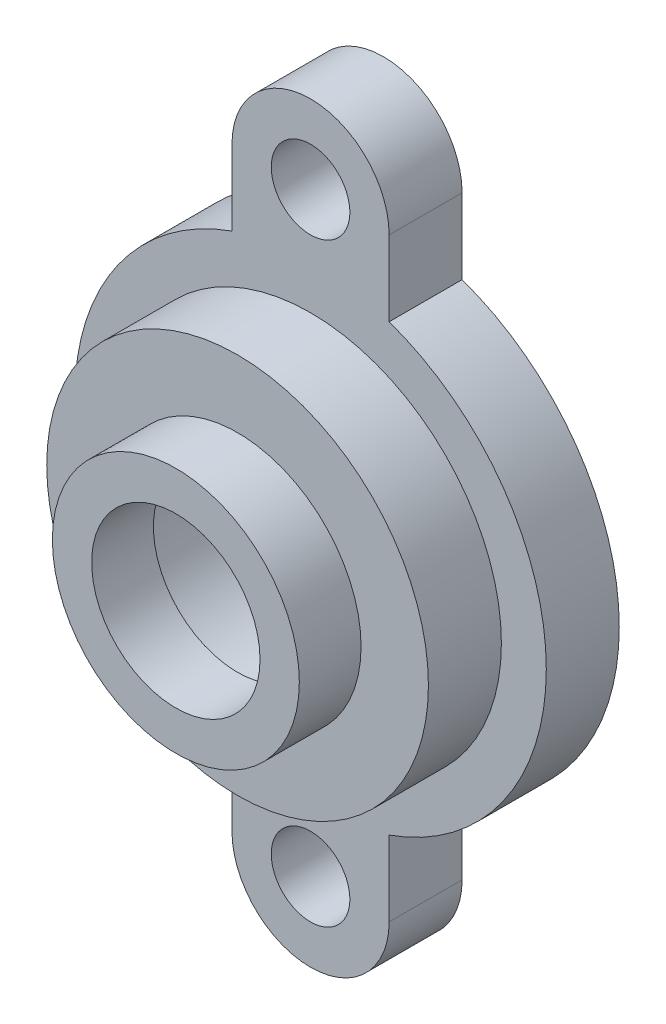
ISO-10303-21;
HEADER;
FILE_DESCRIPTION(('STEP AP214'),'2;1');
FILE_NAME('part.step','',(''),(''),'','','');
FILE_SCHEMA(('AUTOMOTIVE_DESIGN { 1 0 10303 214 1 1 1 1 }'));
ENDSEC;
DATA;
#1=APPLICATION_CONTEXT('core data for automotive mechanical design processes');
#2=APPLICATION_PROTOCOL_DEFINITION('international standard','automotive_design',2000,#1);
#3=PRODUCT_CONTEXT('',#1,'mechanical');
#4=PRODUCT('Part','Part','',(#3));
#5=PRODUCT_RELATED_PRODUCT_CATEGORY('part','',(#4));
#6=PRODUCT_DEFINITION_FORMATION('','',#4);
#7=PRODUCT_DEFINITION_CONTEXT('part definition',#1,'design');
#8=PRODUCT_DEFINITION('design','',#6,#7);
#9=PRODUCT_DEFINITION_SHAPE('','',#8);
#10=(LENGTH_UNIT() NAMED_UNIT(*) SI_UNIT(.MILLI.,.METRE.));
#11=(NAMED_UNIT(*) PLANE_ANGLE_UNIT() SI_UNIT($,.RADIAN.));
#12=(NAMED_UNIT(*) SI_UNIT($,.STERADIAN.) SOLID_ANGLE_UNIT());
#13=UNCERTAINTY_MEASURE_WITH_UNIT(LENGTH_MEASURE(1.E-05),#10,'distance_accuracy_value','');
#14=(GEOMETRIC_REPRESENTATION_CONTEXT(3) GLOBAL_UNCERTAINTY_ASSIGNED_CONTEXT((#13)) GLOBAL_UNIT_ASSIGNED_CONTEXT((#10,
#11,#12)) REPRESENTATION_CONTEXT('',''));
#15=CARTESIAN_POINT('',(0.,0.,0.));
#16=DIRECTION('',(0.,0.,1.));
#17=DIRECTION('',(1.,0.,0.));
#18=AXIS2_PLACEMENT_3D('',#15,#16,#17);
#19=CARTESIAN_POINT('',(0.,0.,6.5));
#20=DIRECTION('',(0.,0.,-1.));
#21=DIRECTION('',(-1.,0.,0.));
#22=AXIS2_PLACEMENT_3D('',#19,#20,#21);
#23=CYLINDRICAL_SURFACE('',#22,21.);
#24=DIRECTION('',(0.,0.,-1.));
#25=VECTOR('',#24,1.);
#26=CARTESIAN_POINT('',(7.,19.7989898732233,6.5));
#27=LINE('',#26,#25);
#28=CARTESIAN_POINT('',(7.,19.7989898732233,6.5));
#29=VERTEX_POINT('',#28);
#30=CARTESIAN_POINT('',(7.,19.7989898732233,0.));
#31=VERTEX_POINT('',#30);
#32=EDGE_CURVE('E140',#29,#31,#27,.T.);
#33=ORIENTED_EDGE('',*,*,#32,.F.);
#34=CARTESIAN_POINT('',(0.,0.,6.5));
#35=DIRECTION('',(0.,0.,1.));
#36=DIRECTION('',(1.,0.,0.));
#37=AXIS2_PLACEMENT_3D('',#34,#35,#36);
#38=CIRCLE('',#37,21.);
#39=CARTESIAN_POINT('',(7.,-19.7989898732233,6.5));
#40=VERTEX_POINT('',#39);
#41=EDGE_CURVE('E47',#40,#29,#38,.T.);
#42=ORIENTED_EDGE('',*,*,#41,.F.);
#43=DIRECTION('',(0.,0.,-1.));
#44=VECTOR('',#43,1.);
#45=CARTESIAN_POINT('',(7.,-19.7989898732233,6.5));
#46=LINE('',#45,#44);
#47=CARTESIAN_POINT('',(7.,-19.7989898732233,0.));
#48=VERTEX_POINT('',#47);
#49=EDGE_CURVE('E110',#48,#40,#46,.F.);
#50=ORIENTED_EDGE('',*,*,#49,.F.);
#51=CARTESIAN_POINT('',(0.,0.,0.));
#52=DIRECTION('',(0.,0.,1.));
#53=DIRECTION('',(1.,0.,0.));
#54=AXIS2_PLACEMENT_3D('',#51,#52,#53);
#55=CIRCLE('',#54,21.);
#56=EDGE_CURVE('E42',#48,#31,#55,.T.);
#57=ORIENTED_EDGE('',*,*,#56,.T.);
#58=EDGE_LOOP('',(#33,#42,#50,#57));
#59=FACE_BOUND('',#58,.T.);
#60=ADVANCED_FACE('F39',(#59),#23,.T.);
#61=DIRECTION('',(0.,0.,-1.));
#62=VECTOR('',#61,1.);
#63=CARTESIAN_POINT('',(-7.,-19.7989898732233,6.5));
#64=LINE('',#63,#62);
#65=CARTESIAN_POINT('',(-7.,-19.7989898732233,6.5));
#66=VERTEX_POINT('',#65);
#67=CARTESIAN_POINT('',(-7.,-19.7989898732233,0.));
#68=VERTEX_POINT('',#67);
#69=EDGE_CURVE('E61',#66,#68,#64,.T.);
#70=ORIENTED_EDGE('',*,*,#69,.F.);
#71=CARTESIAN_POINT('',(-7.,19.7989898732233,6.5));
#72=VERTEX_POINT('',#71);
#73=EDGE_CURVE('E11',#72,#66,#38,.T.);
#74=ORIENTED_EDGE('',*,*,#73,.F.);
#75=DIRECTION('',(0.,0.,-1.));
#76=VECTOR('',#75,1.);
#77=CARTESIAN_POINT('',(-7.,19.7989898732233,6.5));
#78=LINE('',#77,#76);
#79=CARTESIAN_POINT('',(-7.,19.7989898732233,0.));
#80=VERTEX_POINT('',#79);
#81=EDGE_CURVE('E128',#80,#72,#78,.F.);
#82=ORIENTED_EDGE('',*,*,#81,.F.);
#83=EDGE_CURVE('E142',#80,#68,#55,.T.);
#84=ORIENTED_EDGE('',*,*,#83,.T.);
#85=EDGE_LOOP('',(#70,#74,#82,#84));
#86=FACE_BOUND('',#85,.T.);
#87=ADVANCED_FACE('F177',(#86),#23,.T.);
#88=CARTESIAN_POINT('',(0.,0.,6.5));
#89=DIRECTION('',(0.,0.,1.));
#90=DIRECTION('',(1.,0.,0.));
#91=AXIS2_PLACEMENT_3D('',#88,#89,#90);
#92=PLANE('',#91);
#93=CARTESIAN_POINT('',(0.,0.,6.5));
#94=DIRECTION('',(0.,0.,1.));
#95=DIRECTION('',(1.,0.,0.));
#96=AXIS2_PLACEMENT_3D('',#93,#94,#95);
#97=CIRCLE('',#96,17.);
#98=CARTESIAN_POINT('',(17.,0.,6.5));
#99=VERTEX_POINT('',#98);
#100=EDGE_CURVE('E187',#99,#99,#97,.F.);
#101=ORIENTED_EDGE('',*,*,#100,.T.);
#102=EDGE_LOOP('',(#101));
#103=FACE_BOUND('',#102,.T.);
#104=CARTESIAN_POINT('',(0.,26.5,6.5));
#105=DIRECTION('',(0.,0.,1.));
#106=DIRECTION('',(1.,0.,0.));
#107=AXIS2_PLACEMENT_3D('',#104,#105,#106);
#108=CIRCLE('',#107,3.5);
#109=CARTESIAN_POINT('',(-3.5,26.5,6.5));
#110=VERTEX_POINT('',#109);
#111=EDGE_CURVE('E183',#110,#110,#108,.T.);
#112=ORIENTED_EDGE('',*,*,#111,.F.);
#113=EDGE_LOOP('',(#112));
#114=FACE_BOUND('',#113,.T.);
#115=CARTESIAN_POINT('',(0.,-26.5,6.5));
#116=DIRECTION('',(0.,0.,1.));
#117=DIRECTION('',(1.,0.,0.));
#118=AXIS2_PLACEMENT_3D('',#115,#116,#117);
#119=CIRCLE('',#118,3.5);
#120=CARTESIAN_POINT('',(-3.5,-26.5,6.5));
#121=VERTEX_POINT('',#120);
#122=EDGE_CURVE('E190',#121,#121,#119,.T.);
#123=ORIENTED_EDGE('',*,*,#122,.F.);
#124=EDGE_LOOP('',(#123));
#125=FACE_BOUND('',#124,.T.);
#126=ORIENTED_EDGE('',*,*,#73,.T.);
#127=DIRECTION('',(0.,-1.,0.));
#128=VECTOR('',#127,1.);
#129=CARTESIAN_POINT('',(-7.,-26.5,6.5));
#130=LINE('',#129,#128);
#131=CARTESIAN_POINT('',(-7.,-26.5,6.5));
#132=VERTEX_POINT('',#131);
#133=EDGE_CURVE('E119',#66,#132,#130,.T.);
#134=ORIENTED_EDGE('',*,*,#133,.T.);
#135=CARTESIAN_POINT('',(0.,-26.5,6.5));
#136=DIRECTION('',(0.,0.,1.));
#137=DIRECTION('',(1.,0.,0.));
#138=AXIS2_PLACEMENT_3D('',#135,#136,#137);
#139=CIRCLE('',#138,7.);
#140=CARTESIAN_POINT('',(7.,-26.5,6.5));
#141=VERTEX_POINT('',#140);
#142=EDGE_CURVE('E116',#132,#141,#139,.T.);
#143=ORIENTED_EDGE('',*,*,#142,.T.);
#144=DIRECTION('',(0.,1.,0.));
#145=VECTOR('',#144,1.);
#146=CARTESIAN_POINT('',(7.,-26.5,6.5));
#147=LINE('',#146,#145);
#148=EDGE_CURVE('E103',#141,#40,#147,.T.);
#149=ORIENTED_EDGE('',*,*,#148,.T.);
#150=ORIENTED_EDGE('',*,*,#41,.T.);
#151=CARTESIAN_POINT('',(7.,26.5,6.5));
#152=VERTEX_POINT('',#151);
#153=EDGE_CURVE('E113',#29,#152,#147,.T.);
#154=ORIENTED_EDGE('',*,*,#153,.T.);
#155=CARTESIAN_POINT('',(0.,26.5,6.5));
#156=DIRECTION('',(0.,0.,1.));
#157=DIRECTION('',(1.,0.,0.));
#158=AXIS2_PLACEMENT_3D('',#155,#156,#157);
#159=CIRCLE('',#158,7.);
#160=CARTESIAN_POINT('',(-7.,26.5,6.5));
#161=VERTEX_POINT('',#160);
#162=EDGE_CURVE('E112',#152,#161,#159,.T.);
#163=ORIENTED_EDGE('',*,*,#162,.T.);
#164=EDGE_CURVE('E167',#161,#72,#130,.T.);
#165=ORIENTED_EDGE('',*,*,#164,.T.);
#166=EDGE_LOOP('',(#126,#134,#143,#149,#150,#154,#163,#165));
#167=FACE_BOUND('',#166,.T.);
#168=ADVANCED_FACE('F117',(#103,#114,#125,#167),#92,.T.);
#169=CARTESIAN_POINT('',(0.,0.,0.));
#170=DIRECTION('',(0.,0.,1.));
#171=DIRECTION('',(1.,0.,0.));
#172=AXIS2_PLACEMENT_3D('',#169,#170,#171);
#173=PLANE('',#172);
#174=CARTESIAN_POINT('',(0.,26.5,0.));
#175=DIRECTION('',(0.,0.,1.));
#176=DIRECTION('',(1.,0.,0.));
#177=AXIS2_PLACEMENT_3D('',#174,#175,#176);
#178=CIRCLE('',#177,3.5);
#179=CARTESIAN_POINT('',(-3.5,26.5,0.));
#180=VERTEX_POINT('',#179);
#181=EDGE_CURVE('E186',#180,#180,#178,.T.);
#182=ORIENTED_EDGE('',*,*,#181,.T.);
#183=EDGE_LOOP('',(#182));
#184=FACE_BOUND('',#183,.T.);
#185=CARTESIAN_POINT('',(0.,-26.5,0.));
#186=DIRECTION('',(0.,0.,1.));
#187=DIRECTION('',(1.,0.,0.));
#188=AXIS2_PLACEMENT_3D('',#185,#186,#187);
#189=CIRCLE('',#188,3.5);
#190=CARTESIAN_POINT('',(-3.5,-26.5,0.));
#191=VERTEX_POINT('',#190);
#192=EDGE_CURVE('E182',#191,#191,#189,.T.);
#193=ORIENTED_EDGE('',*,*,#192,.T.);
#194=EDGE_LOOP('',(#193));
#195=FACE_BOUND('',#194,.T.);
#196=ORIENTED_EDGE('',*,*,#83,.F.);
#197=DIRECTION('',(0.,-1.,0.));
#198=VECTOR('',#197,1.);
#199=CARTESIAN_POINT('',(-7.,-26.5,0.));
#200=LINE('',#199,#198);
#201=CARTESIAN_POINT('',(-7.,26.5,0.));
#202=VERTEX_POINT('',#201);
#203=EDGE_CURVE('E123',#202,#80,#200,.T.);
#204=ORIENTED_EDGE('',*,*,#203,.F.);
#205=CARTESIAN_POINT('',(0.,26.5,0.));
#206=DIRECTION('',(0.,0.,1.));
#207=DIRECTION('',(1.,0.,0.));
#208=AXIS2_PLACEMENT_3D('',#205,#206,#207);
#209=CIRCLE('',#208,7.);
#210=CARTESIAN_POINT('',(7.,26.5,0.));
#211=VERTEX_POINT('',#210);
#212=EDGE_CURVE('E155',#211,#202,#209,.T.);
#213=ORIENTED_EDGE('',*,*,#212,.F.);
#214=DIRECTION('',(0.,1.,0.));
#215=VECTOR('',#214,1.);
#216=CARTESIAN_POINT('',(7.,-26.5,0.));
#217=LINE('',#216,#215);
#218=EDGE_CURVE('E150',#31,#211,#217,.T.);
#219=ORIENTED_EDGE('',*,*,#218,.F.);
#220=ORIENTED_EDGE('',*,*,#56,.F.);
#221=CARTESIAN_POINT('',(7.,-26.5,0.));
#222=VERTEX_POINT('',#221);
#223=EDGE_CURVE('E156',#222,#48,#217,.T.);
#224=ORIENTED_EDGE('',*,*,#223,.F.);
#225=CARTESIAN_POINT('',(0.,-26.5,0.));
#226=DIRECTION('',(0.,0.,1.));
#227=DIRECTION('',(1.,0.,0.));
#228=AXIS2_PLACEMENT_3D('',#225,#226,#227);
#229=CIRCLE('',#228,7.);
#230=CARTESIAN_POINT('',(-7.,-26.5,0.));
#231=VERTEX_POINT('',#230);
#232=EDGE_CURVE('E127',#231,#222,#229,.T.);
#233=ORIENTED_EDGE('',*,*,#232,.F.);
#234=EDGE_CURVE('E163',#68,#231,#200,.T.);
#235=ORIENTED_EDGE('',*,*,#234,.F.);
#236=EDGE_LOOP('',(#196,#204,#213,#219,#220,#224,#233,#235));
#237=FACE_BOUND('',#236,.T.);
#238=CARTESIAN_POINT('',(0.,0.,0.));
#239=DIRECTION('',(0.,0.,1.));
#240=DIRECTION('',(1.,0.,0.));
#241=AXIS2_PLACEMENT_3D('',#238,#239,#240);
#242=CIRCLE('',#241,9.5);
#243=CARTESIAN_POINT('',(-9.5,0.,0.));
#244=VERTEX_POINT('',#243);
#245=EDGE_CURVE('E158',#244,#244,#242,.T.);
#246=ORIENTED_EDGE('',*,*,#245,.T.);
#247=EDGE_LOOP('',(#246));
#248=FACE_BOUND('',#247,.T.);
#249=ADVANCED_FACE('F152',(#184,#195,#237,#248),#173,.F.);
#250=CARTESIAN_POINT('',(0.,-26.5,6.5));
#251=DIRECTION('',(0.,0.,-1.));
#252=DIRECTION('',(-1.,0.,0.));
#253=AXIS2_PLACEMENT_3D('',#250,#251,#252);
#254=CYLINDRICAL_SURFACE('',#253,7.);
#255=ORIENTED_EDGE('',*,*,#232,.T.);
#256=DIRECTION('',(0.,0.,-1.));
#257=VECTOR('',#256,1.);
#258=CARTESIAN_POINT('',(7.,-26.5,6.5));
#259=LINE('',#258,#257);
#260=EDGE_CURVE('E108',#141,#222,#259,.T.);
#261=ORIENTED_EDGE('',*,*,#260,.F.);
#262=ORIENTED_EDGE('',*,*,#142,.F.);
#263=DIRECTION('',(0.,0.,-1.));
#264=VECTOR('',#263,1.);
#265=CARTESIAN_POINT('',(-7.,-26.5,6.5));
#266=LINE('',#265,#264);
#267=EDGE_CURVE('E166',#132,#231,#266,.T.);
#268=ORIENTED_EDGE('',*,*,#267,.T.);
#269=EDGE_LOOP('',(#255,#261,#262,#268));
#270=FACE_BOUND('',#269,.T.);
#271=ADVANCED_FACE('F125',(#270),#254,.T.);
#272=CARTESIAN_POINT('',(-7.,-26.5,6.5));
#273=DIRECTION('',(1.,0.,0.));
#274=DIRECTION('',(0.,0.,-1.));
#275=AXIS2_PLACEMENT_3D('',#272,#273,#274);
#276=PLANE('',#275);
#277=ORIENTED_EDGE('',*,*,#133,.F.);
#278=ORIENTED_EDGE('',*,*,#69,.T.);
#279=ORIENTED_EDGE('',*,*,#234,.T.);
#280=ORIENTED_EDGE('',*,*,#267,.F.);
#281=EDGE_LOOP('',(#277,#278,#279,#280));
#282=FACE_BOUND('',#281,.T.);
#283=ADVANCED_FACE('F278',(#282),#276,.F.);
#284=CARTESIAN_POINT('',(7.,-26.5,6.5));
#285=DIRECTION('',(-1.,0.,0.));
#286=DIRECTION('',(0.,0.,1.));
#287=AXIS2_PLACEMENT_3D('',#284,#285,#286);
#288=PLANE('',#287);
#289=ORIENTED_EDGE('',*,*,#223,.T.);
#290=ORIENTED_EDGE('',*,*,#49,.T.);
#291=ORIENTED_EDGE('',*,*,#148,.F.);
#292=ORIENTED_EDGE('',*,*,#260,.T.);
#293=EDGE_LOOP('',(#289,#290,#291,#292));
#294=FACE_BOUND('',#293,.T.);
#295=ADVANCED_FACE('F106',(#294),#288,.F.);
#296=ORIENTED_EDGE('',*,*,#153,.F.);
#297=ORIENTED_EDGE('',*,*,#32,.T.);
#298=ORIENTED_EDGE('',*,*,#218,.T.);
#299=DIRECTION('',(0.,0.,-1.));
#300=VECTOR('',#299,1.);
#301=CARTESIAN_POINT('',(7.,26.5,6.5));
#302=LINE('',#301,#300);
#303=EDGE_CURVE('E129',#152,#211,#302,.T.);
#304=ORIENTED_EDGE('',*,*,#303,.F.);
#305=EDGE_LOOP('',(#296,#297,#298,#304));
#306=FACE_BOUND('',#305,.T.);
#307=ADVANCED_FACE('F148',(#306),#288,.F.);
#308=ORIENTED_EDGE('',*,*,#203,.T.);
#309=ORIENTED_EDGE('',*,*,#81,.T.);
#310=ORIENTED_EDGE('',*,*,#164,.F.);
#311=DIRECTION('',(0.,0.,-1.));
#312=VECTOR('',#311,1.);
#313=CARTESIAN_POINT('',(-7.,26.5,6.5));
#314=LINE('',#313,#312);
#315=EDGE_CURVE('E134',#161,#202,#314,.T.);
#316=ORIENTED_EDGE('',*,*,#315,.T.);
#317=EDGE_LOOP('',(#308,#309,#310,#316));
#318=FACE_BOUND('',#317,.T.);
#319=ADVANCED_FACE('F172',(#318),#276,.F.);
#320=CARTESIAN_POINT('',(0.,26.5,6.5));
#321=DIRECTION('',(0.,0.,-1.));
#322=DIRECTION('',(-1.,0.,0.));
#323=AXIS2_PLACEMENT_3D('',#320,#321,#322);
#324=CYLINDRICAL_SURFACE('',#323,7.);
#325=ORIENTED_EDGE('',*,*,#212,.T.);
#326=ORIENTED_EDGE('',*,*,#315,.F.);
#327=ORIENTED_EDGE('',*,*,#162,.F.);
#328=ORIENTED_EDGE('',*,*,#303,.T.);
#329=EDGE_LOOP('',(#325,#326,#327,#328));
#330=FACE_BOUND('',#329,.T.);
#331=ADVANCED_FACE('F281',(#330),#324,.T.);
#332=CARTESIAN_POINT('',(0.,0.,6.5));
#333=DIRECTION('',(0.,0.,-1.));
#334=DIRECTION('',(-1.,0.,0.));
#335=AXIS2_PLACEMENT_3D('',#332,#333,#334);
#336=CYLINDRICAL_SURFACE('',#335,9.5);
#337=CARTESIAN_POINT('',(0.,0.,13.));
#338=DIRECTION('',(0.,0.,1.));
#339=DIRECTION('',(1.,0.,0.));
#340=AXIS2_PLACEMENT_3D('',#337,#338,#339);
#341=CIRCLE('',#340,9.5);
#342=CARTESIAN_POINT('',(-9.5,0.,13.));
#343=VERTEX_POINT('',#342);
#344=EDGE_CURVE('E212',#343,#343,#341,.T.);
#345=CARTESIAN_POINT('',(-9.5,0.,0.));
#346=CARTESIAN_POINT('',(-9.5,0.,0.135416666666667));
#347=CARTESIAN_POINT('',(-9.5,0.,0.270833333333334));
#348=CARTESIAN_POINT('',(-9.5,0.,0.541666666666667));
#349=CARTESIAN_POINT('',(-9.5,0.,0.677083333333333));
#350=CARTESIAN_POINT('',(-9.5,0.,0.947916666666667));
#351=CARTESIAN_POINT('',(-9.5,0.,1.08333333333333));
#352=CARTESIAN_POINT('',(-9.5,0.,1.35416666666667));
#353=CARTESIAN_POINT('',(-9.5,0.,1.48958333333333));
#354=CARTESIAN_POINT('',(-9.5,0.,1.76041666666667));
#355=CARTESIAN_POINT('',(-9.5,0.,1.89583333333333));
#356=CARTESIAN_POINT('',(-9.5,0.,2.16666666666667));
#357=CARTESIAN_POINT('',(-9.5,0.,2.30208333333333));
#358=CARTESIAN_POINT('',(-9.5,0.,2.57291666666667));
#359=CARTESIAN_POINT('',(-9.5,0.,2.70833333333333));
#360=CARTESIAN_POINT('',(-9.5,0.,2.97916666666667));
#361=CARTESIAN_POINT('',(-9.5,0.,3.11458333333333));
#362=CARTESIAN_POINT('',(-9.5,0.,3.38541666666667));
#363=CARTESIAN_POINT('',(-9.5,0.,3.52083333333333));
#364=CARTESIAN_POINT('',(-9.5,0.,3.79166666666667));
#365=CARTESIAN_POINT('',(-9.5,0.,3.92708333333333));
#366=CARTESIAN_POINT('',(-9.5,0.,4.19791666666667));
#367=CARTESIAN_POINT('',(-9.5,0.,4.33333333333333));
#368=CARTESIAN_POINT('',(-9.5,0.,4.60416666666667));
#369=CARTESIAN_POINT('',(-9.5,0.,4.73958333333333));
#370=CARTESIAN_POINT('',(-9.5,0.,5.01041666666667));
#371=CARTESIAN_POINT('',(-9.5,0.,5.14583333333333));
#372=CARTESIAN_POINT('',(-9.5,0.,5.41666666666667));
#373=CARTESIAN_POINT('',(-9.5,0.,5.55208333333333));
#374=CARTESIAN_POINT('',(-9.5,0.,5.82291666666667));
#375=CARTESIAN_POINT('',(-9.5,0.,5.95833333333333));
#376=CARTESIAN_POINT('',(-9.5,0.,6.22916666666667));
#377=CARTESIAN_POINT('',(-9.5,0.,6.36458333333333));
#378=CARTESIAN_POINT('',(-9.5,0.,6.63541666666667));
#379=CARTESIAN_POINT('',(-9.5,0.,6.77083333333333));
#380=CARTESIAN_POINT('',(-9.5,0.,7.04166666666667));
#381=CARTESIAN_POINT('',(-9.5,0.,7.17708333333333));
#382=CARTESIAN_POINT('',(-9.5,0.,7.44791666666667));
#383=CARTESIAN_POINT('',(-9.5,0.,7.58333333333333));
#384=CARTESIAN_POINT('',(-9.5,0.,7.85416666666667));
#385=CARTESIAN_POINT('',(-9.5,0.,7.98958333333333));
#386=CARTESIAN_POINT('',(-9.5,0.,8.26041666666667));
#387=CARTESIAN_POINT('',(-9.5,0.,8.39583333333333));
#388=CARTESIAN_POINT('',(-9.5,0.,8.66666666666667));
#389=CARTESIAN_POINT('',(-9.5,0.,8.80208333333333));
#390=CARTESIAN_POINT('',(-9.5,0.,9.07291666666667));
#391=CARTESIAN_POINT('',(-9.5,0.,9.20833333333333));
#392=CARTESIAN_POINT('',(-9.5,0.,9.47916666666667));
#393=CARTESIAN_POINT('',(-9.5,0.,9.61458333333333));
#394=CARTESIAN_POINT('',(-9.5,0.,9.88541666666667));
#395=CARTESIAN_POINT('',(-9.5,0.,10.0208333333333));
#396=CARTESIAN_POINT('',(-9.5,0.,10.2916666666667));
#397=CARTESIAN_POINT('',(-9.5,0.,10.4270833333333));
#398=CARTESIAN_POINT('',(-9.5,0.,10.6979166666667));
#399=CARTESIAN_POINT('',(-9.5,0.,10.8333333333333));
#400=CARTESIAN_POINT('',(-9.5,0.,11.1041666666667));
#401=CARTESIAN_POINT('',(-9.5,0.,11.2395833333333));
#402=CARTESIAN_POINT('',(-9.5,0.,11.5104166666667));
#403=CARTESIAN_POINT('',(-9.5,0.,11.6458333333333));
#404=CARTESIAN_POINT('',(-9.5,0.,11.9166666666667));
#405=CARTESIAN_POINT('',(-9.5,0.,12.0520833333333));
#406=CARTESIAN_POINT('',(-9.5,0.,12.3229166666667));
#407=CARTESIAN_POINT('',(-9.5,0.,12.4583333333333));
#408=CARTESIAN_POINT('',(-9.5,0.,12.7291666666667));
#409=CARTESIAN_POINT('',(-9.5,0.,12.8645833333333));
#410=CARTESIAN_POINT('',(-9.5,0.,13.));
#411=B_SPLINE_CURVE_WITH_KNOTS('',3,(#345,#346,#347,#348,#349,#350,#351,#352,#353,#354,#355,
#356,#357,#358,#359,#360,#361,#362,#363,#364,#365,#366,#367,#368,#369,#370,#371,#372,#373,#374,
#375,#376,#377,#378,#379,#380,#381,#382,#383,#384,#385,#386,#387,#388,#389,#390,#391,#392,#393,
#394,#395,#396,#397,#398,#399,#400,#401,#402,#403,#404,#405,#406,#407,#408,#409,#410),
.UNSPECIFIED.,.F.,.F.,(4,2,2,2,2,2,2,2,2,2,2,2,2,2,2,2,2,2,2,2,2,2,2,2,2,2,2,2,2,2,2,2,4),(0.,
0.40625,0.8125,1.21875,1.625,2.03125,2.4375,2.84375,3.25,3.65625,4.0625,4.46875,4.875,5.28125,
5.6875,6.09375,6.5,6.90625,7.3125,7.71875,8.125,8.53125,8.9375,9.34375,9.75,10.15625,10.5625,
10.96875,11.375,11.78125,12.1875,12.59375,13.),.UNSPECIFIED.);
#412=EDGE_CURVE('BSEAM216',#244,#343,#411,.T.);
#413=ORIENTED_EDGE('',*,*,#245,.F.);
#414=ORIENTED_EDGE('',*,*,#344,.T.);
#415=ORIENTED_EDGE('',*,*,#412,.T.);
#416=ORIENTED_EDGE('',*,*,#412,.F.);
#417=EDGE_LOOP('',(#413,#415,#414,#416));
#418=FACE_BOUND('',#417,.T.);
#419=ADVANCED_FACE('F216',(#418),#336,.F.);
#420=CARTESIAN_POINT('',(0.,-26.5,6.5));
#421=DIRECTION('',(0.,0.,-1.));
#422=DIRECTION('',(-1.,0.,0.));
#423=AXIS2_PLACEMENT_3D('',#420,#421,#422);
#424=CYLINDRICAL_SURFACE('',#423,3.5);
#425=CARTESIAN_POINT('',(-3.5,-26.5,6.5));
#426=CARTESIAN_POINT('',(-3.5,-26.5,6.43229166666667));
#427=CARTESIAN_POINT('',(-3.5,-26.5,6.36458333333333));
#428=CARTESIAN_POINT('',(-3.5,-26.5,6.22916666666667));
#429=CARTESIAN_POINT('',(-3.5,-26.5,6.16145833333333));
#430=CARTESIAN_POINT('',(-3.5,-26.5,6.02604166666667));
#431=CARTESIAN_POINT('',(-3.5,-26.5,5.95833333333333));
#432=CARTESIAN_POINT('',(-3.5,-26.5,5.82291666666667));
#433=CARTESIAN_POINT('',(-3.5,-26.5,5.75520833333333));
#434=CARTESIAN_POINT('',(-3.5,-26.5,5.61979166666667));
#435=CARTESIAN_POINT('',(-3.5,-26.5,5.55208333333333));
#436=CARTESIAN_POINT('',(-3.5,-26.5,5.41666666666667));
#437=CARTESIAN_POINT('',(-3.5,-26.5,5.34895833333333));
#438=CARTESIAN_POINT('',(-3.5,-26.5,5.21354166666667));
#439=CARTESIAN_POINT('',(-3.5,-26.5,5.14583333333333));
#440=CARTESIAN_POINT('',(-3.5,-26.5,5.01041666666667));
#441=CARTESIAN_POINT('',(-3.5,-26.5,4.94270833333333));
#442=CARTESIAN_POINT('',(-3.5,-26.5,4.80729166666667));
#443=CARTESIAN_POINT('',(-3.5,-26.5,4.73958333333333));
#444=CARTESIAN_POINT('',(-3.5,-26.5,4.60416666666667));
#445=CARTESIAN_POINT('',(-3.5,-26.5,4.53645833333333));
#446=CARTESIAN_POINT('',(-3.5,-26.5,4.40104166666667));
#447=CARTESIAN_POINT('',(-3.5,-26.5,4.33333333333333));
#448=CARTESIAN_POINT('',(-3.5,-26.5,4.19791666666667));
#449=CARTESIAN_POINT('',(-3.5,-26.5,4.13020833333333));
#450=CARTESIAN_POINT('',(-3.5,-26.5,3.99479166666667));
#451=CARTESIAN_POINT('',(-3.5,-26.5,3.92708333333333));
#452=CARTESIAN_POINT('',(-3.5,-26.5,3.79166666666667));
#453=CARTESIAN_POINT('',(-3.5,-26.5,3.72395833333333));
#454=CARTESIAN_POINT('',(-3.5,-26.5,3.58854166666667));
#455=CARTESIAN_POINT('',(-3.5,-26.5,3.52083333333333));
#456=CARTESIAN_POINT('',(-3.5,-26.5,3.38541666666667));
#457=CARTESIAN_POINT('',(-3.5,-26.5,3.31770833333333));
#458=CARTESIAN_POINT('',(-3.5,-26.5,3.18229166666667));
#459=CARTESIAN_POINT('',(-3.5,-26.5,3.11458333333333));
#460=CARTESIAN_POINT('',(-3.5,-26.5,2.97916666666667));
#461=CARTESIAN_POINT('',(-3.5,-26.5,2.91145833333333));
#462=CARTESIAN_POINT('',(-3.5,-26.5,2.77604166666667));
#463=CARTESIAN_POINT('',(-3.5,-26.5,2.70833333333333));
#464=CARTESIAN_POINT('',(-3.5,-26.5,2.57291666666667));
#465=CARTESIAN_POINT('',(-3.5,-26.5,2.50520833333333));
#466=CARTESIAN_POINT('',(-3.5,-26.5,2.36979166666667));
#467=CARTESIAN_POINT('',(-3.5,-26.5,2.30208333333333));
#468=CARTESIAN_POINT('',(-3.5,-26.5,2.16666666666667));
#469=CARTESIAN_POINT('',(-3.5,-26.5,2.09895833333333));
#470=CARTESIAN_POINT('',(-3.5,-26.5,1.96354166666667));
#471=CARTESIAN_POINT('',(-3.5,-26.5,1.89583333333333));
#472=CARTESIAN_POINT('',(-3.5,-26.5,1.76041666666667));
#473=CARTESIAN_POINT('',(-3.5,-26.5,1.69270833333333));
#474=CARTESIAN_POINT('',(-3.5,-26.5,1.55729166666667));
#475=CARTESIAN_POINT('',(-3.5,-26.5,1.48958333333333));
#476=CARTESIAN_POINT('',(-3.5,-26.5,1.35416666666667));
#477=CARTESIAN_POINT('',(-3.5,-26.5,1.28645833333333));
#478=CARTESIAN_POINT('',(-3.5,-26.5,1.15104166666667));
#479=CARTESIAN_POINT('',(-3.5,-26.5,1.08333333333333));
#480=CARTESIAN_POINT('',(-3.5,-26.5,0.947916666666667));
#481=CARTESIAN_POINT('',(-3.5,-26.5,0.880208333333333));
#482=CARTESIAN_POINT('',(-3.5,-26.5,0.744791666666667));
#483=CARTESIAN_POINT('',(-3.5,-26.5,0.677083333333333));
#484=CARTESIAN_POINT('',(-3.5,-26.5,0.541666666666667));
#485=CARTESIAN_POINT('',(-3.5,-26.5,0.473958333333333));
#486=CARTESIAN_POINT('',(-3.5,-26.5,0.338541666666667));
#487=CARTESIAN_POINT('',(-3.5,-26.5,0.270833333333334));
#488=CARTESIAN_POINT('',(-3.5,-26.5,0.135416666666667));
#489=CARTESIAN_POINT('',(-3.5,-26.5,0.0677083333333334));
#490=CARTESIAN_POINT('',(-3.5,-26.5,0.));
#491=B_SPLINE_CURVE_WITH_KNOTS('',3,(#425,#426,#427,#428,#429,#430,#431,#432,#433,#434,#435,
#436,#437,#438,#439,#440,#441,#442,#443,#444,#445,#446,#447,#448,#449,#450,#451,#452,#453,#454,
#455,#456,#457,#458,#459,#460,#461,#462,#463,#464,#465,#466,#467,#468,#469,#470,#471,#472,#473,
#474,#475,#476,#477,#478,#479,#480,#481,#482,#483,#484,#485,#486,#487,#488,#489,#490),
.UNSPECIFIED.,.F.,.F.,(4,2,2,2,2,2,2,2,2,2,2,2,2,2,2,2,2,2,2,2,2,2,2,2,2,2,2,2,2,2,2,2,4),(0.,
0.203124999999999,0.40625,0.609375,0.812499999999999,1.015625,1.21875,1.421875,1.625,1.828125,
2.03125,2.234375,2.4375,2.640625,2.84375,3.046875,3.25,3.453125,3.65625,3.859375,4.0625,
4.265625,4.46875,4.671875,4.875,5.078125,5.28125,5.484375,5.6875,5.890625,6.09375,6.296875,6.5),.UNSPECIFIED.);
#492=EDGE_CURVE('BSEAM256',#121,#191,#491,.T.);
#493=ORIENTED_EDGE('',*,*,#122,.T.);
#494=ORIENTED_EDGE('',*,*,#192,.F.);
#495=ORIENTED_EDGE('',*,*,#492,.T.);
#496=ORIENTED_EDGE('',*,*,#492,.F.);
#497=EDGE_LOOP('',(#493,#495,#494,#496));
#498=FACE_BOUND('',#497,.T.);
#499=ADVANCED_FACE('F256',(#498),#424,.F.);
#500=CARTESIAN_POINT('',(0.,26.5,6.5));
#501=DIRECTION('',(0.,0.,-1.));
#502=DIRECTION('',(-1.,0.,0.));
#503=AXIS2_PLACEMENT_3D('',#500,#501,#502);
#504=CYLINDRICAL_SURFACE('',#503,3.5);
#505=CARTESIAN_POINT('',(-3.5,26.5,6.5));
#506=CARTESIAN_POINT('',(-3.5,26.5,6.43229166666667));
#507=CARTESIAN_POINT('',(-3.5,26.5,6.36458333333333));
#508=CARTESIAN_POINT('',(-3.5,26.5,6.22916666666667));
#509=CARTESIAN_POINT('',(-3.5,26.5,6.16145833333333));
#510=CARTESIAN_POINT('',(-3.5,26.5,6.02604166666667));
#511=CARTESIAN_POINT('',(-3.5,26.5,5.95833333333333));
#512=CARTESIAN_POINT('',(-3.5,26.5,5.82291666666667));
#513=CARTESIAN_POINT('',(-3.5,26.5,5.75520833333333));
#514=CARTESIAN_POINT('',(-3.5,26.5,5.61979166666667));
#515=CARTESIAN_POINT('',(-3.5,26.5,5.55208333333333));
#516=CARTESIAN_POINT('',(-3.5,26.5,5.41666666666667));
#517=CARTESIAN_POINT('',(-3.5,26.5,5.34895833333333));
#518=CARTESIAN_POINT('',(-3.5,26.5,5.21354166666667));
#519=CARTESIAN_POINT('',(-3.5,26.5,5.14583333333333));
#520=CARTESIAN_POINT('',(-3.5,26.5,5.01041666666667));
#521=CARTESIAN_POINT('',(-3.5,26.5,4.94270833333333));
#522=CARTESIAN_POINT('',(-3.5,26.5,4.80729166666667));
#523=CARTESIAN_POINT('',(-3.5,26.5,4.73958333333333));
#524=CARTESIAN_POINT('',(-3.5,26.5,4.60416666666667));
#525=CARTESIAN_POINT('',(-3.5,26.5,4.53645833333333));
#526=CARTESIAN_POINT('',(-3.5,26.5,4.40104166666667));
#527=CARTESIAN_POINT('',(-3.5,26.5,4.33333333333333));
#528=CARTESIAN_POINT('',(-3.5,26.5,4.19791666666667));
#529=CARTESIAN_POINT('',(-3.5,26.5,4.13020833333333));
#530=CARTESIAN_POINT('',(-3.5,26.5,3.99479166666667));
#531=CARTESIAN_POINT('',(-3.5,26.5,3.92708333333333));
#532=CARTESIAN_POINT('',(-3.5,26.5,3.79166666666667));
#533=CARTESIAN_POINT('',(-3.5,26.5,3.72395833333333));
#534=CARTESIAN_POINT('',(-3.5,26.5,3.58854166666667));
#535=CARTESIAN_POINT('',(-3.5,26.5,3.52083333333333));
#536=CARTESIAN_POINT('',(-3.5,26.5,3.38541666666667));
#537=CARTESIAN_POINT('',(-3.5,26.5,3.31770833333333));
#538=CARTESIAN_POINT('',(-3.5,26.5,3.18229166666667));
#539=CARTESIAN_POINT('',(-3.5,26.5,3.11458333333333));
#540=CARTESIAN_POINT('',(-3.5,26.5,2.97916666666667));
#541=CARTESIAN_POINT('',(-3.5,26.5,2.91145833333333));
#542=CARTESIAN_POINT('',(-3.5,26.5,2.77604166666667));
#543=CARTESIAN_POINT('',(-3.5,26.5,2.70833333333333));
#544=CARTESIAN_POINT('',(-3.5,26.5,2.57291666666667));
#545=CARTESIAN_POINT('',(-3.5,26.5,2.50520833333333));
#546=CARTESIAN_POINT('',(-3.5,26.5,2.36979166666667));
#547=CARTESIAN_POINT('',(-3.5,26.5,2.30208333333333));
#548=CARTESIAN_POINT('',(-3.5,26.5,2.16666666666667));
#549=CARTESIAN_POINT('',(-3.5,26.5,2.09895833333333));
#550=CARTESIAN_POINT('',(-3.5,26.5,1.96354166666667));
#551=CARTESIAN_POINT('',(-3.5,26.5,1.89583333333333));
#552=CARTESIAN_POINT('',(-3.5,26.5,1.76041666666667));
#553=CARTESIAN_POINT('',(-3.5,26.5,1.69270833333333));
#554=CARTESIAN_POINT('',(-3.5,26.5,1.55729166666667));
#555=CARTESIAN_POINT('',(-3.5,26.5,1.48958333333333));
#556=CARTESIAN_POINT('',(-3.5,26.5,1.35416666666667));
#557=CARTESIAN_POINT('',(-3.5,26.5,1.28645833333333));
#558=CARTESIAN_POINT('',(-3.5,26.5,1.15104166666667));
#559=CARTESIAN_POINT('',(-3.5,26.5,1.08333333333333));
#560=CARTESIAN_POINT('',(-3.5,26.5,0.947916666666667));
#561=CARTESIAN_POINT('',(-3.5,26.5,0.880208333333333));
#562=CARTESIAN_POINT('',(-3.5,26.5,0.744791666666667));
#563=CARTESIAN_POINT('',(-3.5,26.5,0.677083333333333));
#564=CARTESIAN_POINT('',(-3.5,26.5,0.541666666666667));
#565=CARTESIAN_POINT('',(-3.5,26.5,0.473958333333333));
#566=CARTESIAN_POINT('',(-3.5,26.5,0.338541666666667));
#567=CARTESIAN_POINT('',(-3.5,26.5,0.270833333333334));
#568=CARTESIAN_POINT('',(-3.5,26.5,0.135416666666667));
#569=CARTESIAN_POINT('',(-3.5,26.5,0.0677083333333334));
#570=CARTESIAN_POINT('',(-3.5,26.5,0.));
#571=B_SPLINE_CURVE_WITH_KNOTS('',3,(#505,#506,#507,#508,#509,#510,#511,#512,#513,#514,#515,
#516,#517,#518,#519,#520,#521,#522,#523,#524,#525,#526,#527,#528,#529,#530,#531,#532,#533,#534,
#535,#536,#537,#538,#539,#540,#541,#542,#543,#544,#545,#546,#547,#548,#549,#550,#551,#552,#553,
#554,#555,#556,#557,#558,#559,#560,#561,#562,#563,#564,#565,#566,#567,#568,#569,#570),
.UNSPECIFIED.,.F.,.F.,(4,2,2,2,2,2,2,2,2,2,2,2,2,2,2,2,2,2,2,2,2,2,2,2,2,2,2,2,2,2,2,2,4),(0.,
0.203124999999999,0.40625,0.609375,0.812499999999999,1.015625,1.21875,1.421875,1.625,1.828125,
2.03125,2.234375,2.4375,2.640625,2.84375,3.046875,3.25,3.453125,3.65625,3.859375,4.0625,
4.265625,4.46875,4.671875,4.875,5.078125,5.28125,5.484375,5.6875,5.890625,6.09375,6.296875,6.5),.UNSPECIFIED.);
#572=EDGE_CURVE('BSEAM250',#110,#180,#571,.T.);
#573=ORIENTED_EDGE('',*,*,#111,.T.);
#574=ORIENTED_EDGE('',*,*,#181,.F.);
#575=ORIENTED_EDGE('',*,*,#572,.T.);
#576=ORIENTED_EDGE('',*,*,#572,.F.);
#577=EDGE_LOOP('',(#573,#575,#574,#576));
#578=FACE_BOUND('',#577,.T.);
#579=ADVANCED_FACE('F250',(#578),#504,.F.);
#580=CARTESIAN_POINT('',(0.,0.,23.5));
#581=DIRECTION('',(0.,0.,1.));
#582=DIRECTION('',(1.,0.,0.));
#583=AXIS2_PLACEMENT_3D('',#580,#581,#582);
#584=CYLINDRICAL_SURFACE('',#583,17.);
#585=ORIENTED_EDGE('',*,*,#100,.F.);
#586=EDGE_LOOP('',(#585));
#587=FACE_BOUND('',#586,.T.);
#588=CARTESIAN_POINT('',(0.,0.,13.));
#589=DIRECTION('',(0.,0.,1.));
#590=DIRECTION('',(1.,0.,0.));
#591=AXIS2_PLACEMENT_3D('',#588,#589,#590);
#592=CIRCLE('',#591,17.);
#593=CARTESIAN_POINT('',(17.,0.,13.));
#594=VERTEX_POINT('',#593);
#595=EDGE_CURVE('E197',#594,#594,#592,.T.);
#596=ORIENTED_EDGE('',*,*,#595,.F.);
#597=EDGE_LOOP('',(#596));
#598=FACE_BOUND('',#597,.T.);
#599=ADVANCED_FACE('F245',(#587,#598),#584,.T.);
#600=CARTESIAN_POINT('',(0.,17.,13.));
#601=DIRECTION('',(0.,0.,-1.));
#602=DIRECTION('',(-1.,0.,0.));
#603=AXIS2_PLACEMENT_3D('',#600,#601,#602);
#604=PLANE('',#603);
#605=CARTESIAN_POINT('',(0.,0.,13.));
#606=DIRECTION('',(0.,0.,1.));
#607=DIRECTION('',(1.,0.,0.));
#608=AXIS2_PLACEMENT_3D('',#605,#606,#607);
#609=CIRCLE('',#608,11.);
#610=CARTESIAN_POINT('',(11.,0.,13.));
#611=VERTEX_POINT('',#610);
#612=EDGE_CURVE('E200',#611,#611,#609,.T.);
#613=ORIENTED_EDGE('',*,*,#612,.F.);
#614=EDGE_LOOP('',(#613));
#615=FACE_BOUND('',#614,.T.);
#616=ORIENTED_EDGE('',*,*,#595,.T.);
#617=EDGE_LOOP('',(#616));
#618=FACE_BOUND('',#617,.T.);
#619=ADVANCED_FACE('F239',(#615,#618),#604,.F.);
#620=CARTESIAN_POINT('',(0.,0.,23.5));
#621=DIRECTION('',(0.,0.,1.));
#622=DIRECTION('',(1.,0.,0.));
#623=AXIS2_PLACEMENT_3D('',#620,#621,#622);
#624=CYLINDRICAL_SURFACE('',#623,11.);
#625=CARTESIAN_POINT('',(0.,0.,18.5));
#626=DIRECTION('',(0.,0.,1.));
#627=DIRECTION('',(1.,0.,0.));
#628=AXIS2_PLACEMENT_3D('',#625,#626,#627);
#629=CIRCLE('',#628,11.);
#630=CARTESIAN_POINT('',(11.,0.,18.5));
#631=VERTEX_POINT('',#630);
#632=EDGE_CURVE('E203',#631,#631,#629,.T.);
#633=ORIENTED_EDGE('',*,*,#632,.F.);
#634=EDGE_LOOP('',(#633));
#635=FACE_BOUND('',#634,.T.);
#636=ORIENTED_EDGE('',*,*,#612,.T.);
#637=EDGE_LOOP('',(#636));
#638=FACE_BOUND('',#637,.T.);
#639=ADVANCED_FACE('F233',(#635,#638),#624,.T.);
#640=CARTESIAN_POINT('',(0.,11.,18.5));
#641=DIRECTION('',(0.,0.,-1.));
#642=DIRECTION('',(-1.,0.,0.));
#643=AXIS2_PLACEMENT_3D('',#640,#641,#642);
#644=PLANE('',#643);
#645=CARTESIAN_POINT('',(0.,0.,18.5));
#646=DIRECTION('',(0.,0.,1.));
#647=DIRECTION('',(1.,0.,0.));
#648=AXIS2_PLACEMENT_3D('',#645,#646,#647);
#649=CIRCLE('',#648,7.5);
#650=CARTESIAN_POINT('',(7.5,0.,18.5));
#651=VERTEX_POINT('',#650);
#652=EDGE_CURVE('E206',#651,#651,#649,.T.);
#653=ORIENTED_EDGE('',*,*,#652,.F.);
#654=EDGE_LOOP('',(#653));
#655=FACE_BOUND('',#654,.T.);
#656=ORIENTED_EDGE('',*,*,#632,.T.);
#657=EDGE_LOOP('',(#656));
#658=FACE_BOUND('',#657,.T.);
#659=ADVANCED_FACE('F227',(#655,#658),#644,.F.);
#660=CARTESIAN_POINT('',(0.,0.,23.5));
#661=DIRECTION('',(0.,0.,1.));
#662=DIRECTION('',(1.,0.,0.));
#663=AXIS2_PLACEMENT_3D('',#660,#661,#662);
#664=CYLINDRICAL_SURFACE('',#663,7.5);
#665=CARTESIAN_POINT('',(0.,0.,13.));
#666=DIRECTION('',(0.,0.,1.));
#667=DIRECTION('',(1.,0.,0.));
#668=AXIS2_PLACEMENT_3D('',#665,#666,#667);
#669=CIRCLE('',#668,7.5);
#670=CARTESIAN_POINT('',(7.5,0.,13.));
#671=VERTEX_POINT('',#670);
#672=EDGE_CURVE('E209',#671,#671,#669,.T.);
#673=ORIENTED_EDGE('',*,*,#672,.F.);
#674=EDGE_LOOP('',(#673));
#675=FACE_BOUND('',#674,.T.);
#676=ORIENTED_EDGE('',*,*,#652,.T.);
#677=EDGE_LOOP('',(#676));
#678=FACE_BOUND('',#677,.T.);
#679=ADVANCED_FACE('F221',(#675,#678),#664,.F.);
#680=CARTESIAN_POINT('',(0.,7.5,13.));
#681=DIRECTION('',(0.,0.,1.));
#682=DIRECTION('',(1.,0.,0.));
#683=AXIS2_PLACEMENT_3D('',#680,#681,#682);
#684=PLANE('',#683);
#685=ORIENTED_EDGE('',*,*,#344,.F.);
#686=EDGE_LOOP('',(#685));
#687=FACE_BOUND('',#686,.T.);
#688=ORIENTED_EDGE('',*,*,#672,.T.);
#689=EDGE_LOOP('',(#688));
#690=FACE_BOUND('',#689,.T.);
#691=ADVANCED_FACE('F218',(#687,#690),#684,.F.);
#692=CLOSED_SHELL('',(#60,#87,#168,#249,#271,#283,#295,#307,#319,#331,#419,#499,#579,#599,#619,
#639,#659,#679,#691));
#693=MANIFOLD_SOLID_BREP('B2',#692);
#694=ADVANCED_BREP_SHAPE_REPRESENTATION('',(#18,#693),#14);
#695=SHAPE_DEFINITION_REPRESENTATION(#9,#694);
ENDSEC;
END-ISO-10303-21;
